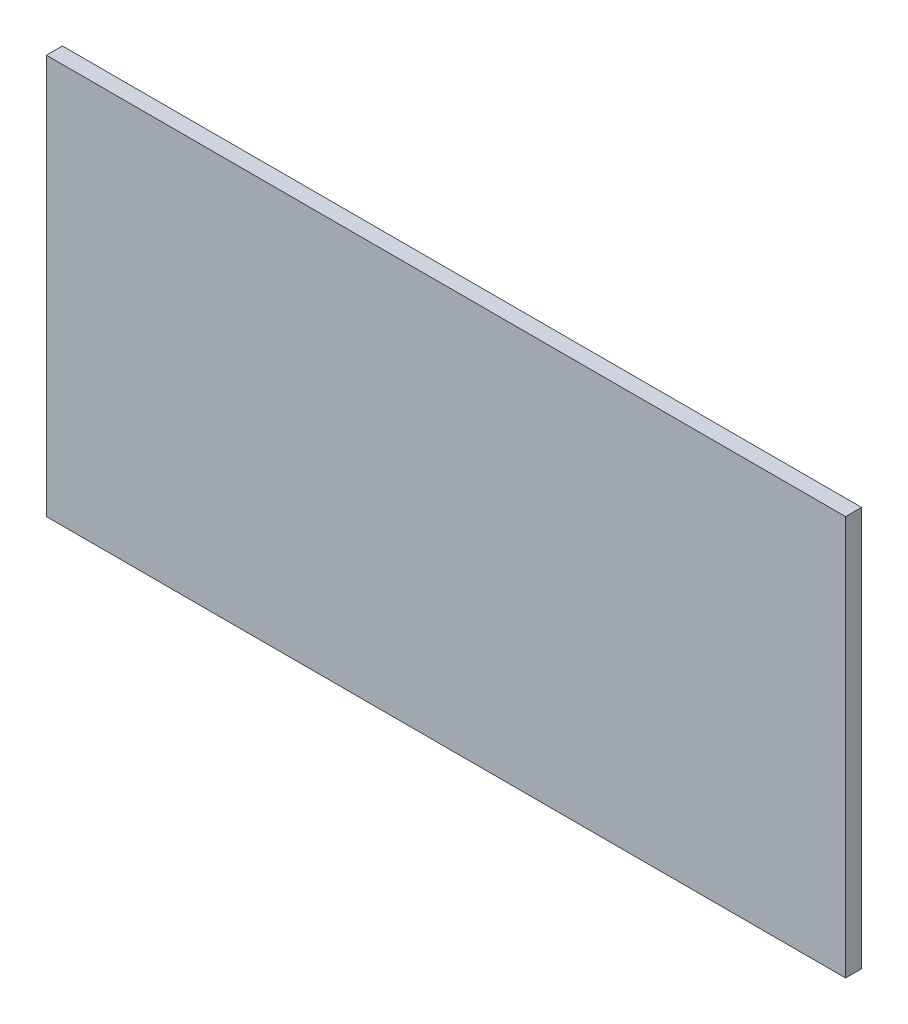
ISO-10303-21;
HEADER;
FILE_DESCRIPTION(('STEP AP214'),'2;1');
FILE_NAME('part.step','',(''),(''),'','','');
FILE_SCHEMA(('AUTOMOTIVE_DESIGN { 1 0 10303 214 1 1 1 1 }'));
ENDSEC;
DATA;
#1=APPLICATION_CONTEXT('core data for automotive mechanical design processes');
#2=APPLICATION_PROTOCOL_DEFINITION('international standard','automotive_design',2000,#1);
#3=PRODUCT_CONTEXT('',#1,'mechanical');
#4=PRODUCT('Part','Part','',(#3));
#5=PRODUCT_RELATED_PRODUCT_CATEGORY('part','',(#4));
#6=PRODUCT_DEFINITION_FORMATION('','',#4);
#7=PRODUCT_DEFINITION_CONTEXT('part definition',#1,'design');
#8=PRODUCT_DEFINITION('design','',#6,#7);
#9=PRODUCT_DEFINITION_SHAPE('','',#8);
#10=(LENGTH_UNIT() NAMED_UNIT(*) SI_UNIT(.MILLI.,.METRE.));
#11=(NAMED_UNIT(*) PLANE_ANGLE_UNIT() SI_UNIT($,.RADIAN.));
#12=(NAMED_UNIT(*) SI_UNIT($,.STERADIAN.) SOLID_ANGLE_UNIT());
#13=UNCERTAINTY_MEASURE_WITH_UNIT(LENGTH_MEASURE(1.E-05),#10,'distance_accuracy_value','');
#14=(GEOMETRIC_REPRESENTATION_CONTEXT(3) GLOBAL_UNCERTAINTY_ASSIGNED_CONTEXT((#13)) GLOBAL_UNIT_ASSIGNED_CONTEXT((#10,
#11,#12)) REPRESENTATION_CONTEXT('',''));
#15=CARTESIAN_POINT('',(0.,0.,0.));
#16=DIRECTION('',(0.,0.,1.));
#17=DIRECTION('',(1.,0.,0.));
#18=AXIS2_PLACEMENT_3D('',#15,#16,#17);
#19=CARTESIAN_POINT('',(400.,-200.,16.));
#20=DIRECTION('',(-1.,0.,0.));
#21=DIRECTION('',(0.,0.,1.));
#22=AXIS2_PLACEMENT_3D('',#19,#20,#21);
#23=PLANE('',#22);
#24=DIRECTION('',(0.,1.,0.));
#25=VECTOR('',#24,1.);
#26=CARTESIAN_POINT('',(400.,-200.,0.));
#27=LINE('',#26,#25);
#28=CARTESIAN_POINT('',(400.,-200.,0.));
#29=VERTEX_POINT('',#28);
#30=CARTESIAN_POINT('',(400.,200.,0.));
#31=VERTEX_POINT('',#30);
#32=EDGE_CURVE('E97',#29,#31,#27,.T.);
#33=ORIENTED_EDGE('',*,*,#32,.T.);
#34=DIRECTION('',(0.,0.,-1.));
#35=VECTOR('',#34,1.);
#36=CARTESIAN_POINT('',(400.,200.,16.));
#37=LINE('',#36,#35);
#38=CARTESIAN_POINT('',(400.,200.,16.));
#39=VERTEX_POINT('',#38);
#40=EDGE_CURVE('E11',#39,#31,#37,.T.);
#41=ORIENTED_EDGE('',*,*,#40,.F.);
#42=DIRECTION('',(0.,1.,0.));
#43=VECTOR('',#42,1.);
#44=CARTESIAN_POINT('',(400.,-200.,16.));
#45=LINE('',#44,#43);
#46=CARTESIAN_POINT('',(400.,-200.,16.));
#47=VERTEX_POINT('',#46);
#48=EDGE_CURVE('E85',#47,#39,#45,.T.);
#49=ORIENTED_EDGE('',*,*,#48,.F.);
#50=DIRECTION('',(0.,0.,-1.));
#51=VECTOR('',#50,1.);
#52=CARTESIAN_POINT('',(400.,-200.,16.));
#53=LINE('',#52,#51);
#54=EDGE_CURVE('E93',#47,#29,#53,.T.);
#55=ORIENTED_EDGE('',*,*,#54,.T.);
#56=EDGE_LOOP('',(#33,#41,#49,#55));
#57=FACE_BOUND('',#56,.T.);
#58=ADVANCED_FACE('F34',(#57),#23,.F.);
#59=CARTESIAN_POINT('',(-400.,200.,16.));
#60=DIRECTION('',(0.,-1.,0.));
#61=DIRECTION('',(0.,0.,-1.));
#62=AXIS2_PLACEMENT_3D('',#59,#60,#61);
#63=PLANE('',#62);
#64=DIRECTION('',(-1.,0.,0.));
#65=VECTOR('',#64,1.);
#66=CARTESIAN_POINT('',(-400.,200.,0.));
#67=LINE('',#66,#65);
#68=CARTESIAN_POINT('',(-400.,200.,0.));
#69=VERTEX_POINT('',#68);
#70=EDGE_CURVE('E89',#31,#69,#67,.T.);
#71=ORIENTED_EDGE('',*,*,#70,.T.);
#72=DIRECTION('',(0.,0.,-1.));
#73=VECTOR('',#72,1.);
#74=CARTESIAN_POINT('',(-400.,200.,16.));
#75=LINE('',#74,#73);
#76=CARTESIAN_POINT('',(-400.,200.,16.));
#77=VERTEX_POINT('',#76);
#78=EDGE_CURVE('E42',#77,#69,#75,.T.);
#79=ORIENTED_EDGE('',*,*,#78,.F.);
#80=DIRECTION('',(-1.,0.,0.));
#81=VECTOR('',#80,1.);
#82=CARTESIAN_POINT('',(-400.,200.,16.));
#83=LINE('',#82,#81);
#84=EDGE_CURVE('E80',#39,#77,#83,.T.);
#85=ORIENTED_EDGE('',*,*,#84,.F.);
#86=ORIENTED_EDGE('',*,*,#40,.T.);
#87=EDGE_LOOP('',(#71,#79,#85,#86));
#88=FACE_BOUND('',#87,.T.);
#89=ADVANCED_FACE('F88',(#88),#63,.F.);
#90=CARTESIAN_POINT('',(-400.,-200.,16.));
#91=DIRECTION('',(1.,0.,0.));
#92=DIRECTION('',(0.,0.,-1.));
#93=AXIS2_PLACEMENT_3D('',#90,#91,#92);
#94=PLANE('',#93);
#95=DIRECTION('',(0.,-1.,0.));
#96=VECTOR('',#95,1.);
#97=CARTESIAN_POINT('',(-400.,-200.,0.));
#98=LINE('',#97,#96);
#99=CARTESIAN_POINT('',(-400.,-200.,0.));
#100=VERTEX_POINT('',#99);
#101=EDGE_CURVE('E67',#69,#100,#98,.T.);
#102=ORIENTED_EDGE('',*,*,#101,.T.);
#103=DIRECTION('',(0.,0.,-1.));
#104=VECTOR('',#103,1.);
#105=CARTESIAN_POINT('',(-400.,-200.,16.));
#106=LINE('',#105,#104);
#107=CARTESIAN_POINT('',(-400.,-200.,16.));
#108=VERTEX_POINT('',#107);
#109=EDGE_CURVE('E90',#108,#100,#106,.T.);
#110=ORIENTED_EDGE('',*,*,#109,.F.);
#111=DIRECTION('',(0.,-1.,0.));
#112=VECTOR('',#111,1.);
#113=CARTESIAN_POINT('',(-400.,-200.,16.));
#114=LINE('',#113,#112);
#115=EDGE_CURVE('E83',#77,#108,#114,.T.);
#116=ORIENTED_EDGE('',*,*,#115,.F.);
#117=ORIENTED_EDGE('',*,*,#78,.T.);
#118=EDGE_LOOP('',(#102,#110,#116,#117));
#119=FACE_BOUND('',#118,.T.);
#120=ADVANCED_FACE('F91',(#119),#94,.F.);
#121=CARTESIAN_POINT('',(-400.,-200.,16.));
#122=DIRECTION('',(0.,1.,0.));
#123=DIRECTION('',(0.,0.,1.));
#124=AXIS2_PLACEMENT_3D('',#121,#122,#123);
#125=PLANE('',#124);
#126=DIRECTION('',(1.,0.,0.));
#127=VECTOR('',#126,1.);
#128=CARTESIAN_POINT('',(-400.,-200.,0.));
#129=LINE('',#128,#127);
#130=EDGE_CURVE('E73',#100,#29,#129,.T.);
#131=ORIENTED_EDGE('',*,*,#130,.T.);
#132=ORIENTED_EDGE('',*,*,#54,.F.);
#133=DIRECTION('',(1.,0.,0.));
#134=VECTOR('',#133,1.);
#135=CARTESIAN_POINT('',(-400.,-200.,16.));
#136=LINE('',#135,#134);
#137=EDGE_CURVE('E50',#108,#47,#136,.T.);
#138=ORIENTED_EDGE('',*,*,#137,.F.);
#139=ORIENTED_EDGE('',*,*,#109,.T.);
#140=EDGE_LOOP('',(#131,#132,#138,#139));
#141=FACE_BOUND('',#140,.T.);
#142=ADVANCED_FACE('F104',(#141),#125,.F.);
#143=CARTESIAN_POINT('',(0.,0.,16.));
#144=DIRECTION('',(0.,0.,-1.));
#145=DIRECTION('',(-1.,0.,0.));
#146=AXIS2_PLACEMENT_3D('',#143,#144,#145);
#147=PLANE('',#146);
#148=ORIENTED_EDGE('',*,*,#48,.T.);
#149=ORIENTED_EDGE('',*,*,#84,.T.);
#150=ORIENTED_EDGE('',*,*,#115,.T.);
#151=ORIENTED_EDGE('',*,*,#137,.T.);
#152=EDGE_LOOP('',(#148,#149,#150,#151));
#153=FACE_BOUND('',#152,.T.);
#154=ADVANCED_FACE('F81',(#153),#147,.F.);
#155=CARTESIAN_POINT('',(0.,0.,0.));
#156=DIRECTION('',(0.,0.,-1.));
#157=DIRECTION('',(-1.,0.,0.));
#158=AXIS2_PLACEMENT_3D('',#155,#156,#157);
#159=PLANE('',#158);
#160=ORIENTED_EDGE('',*,*,#32,.F.);
#161=ORIENTED_EDGE('',*,*,#130,.F.);
#162=ORIENTED_EDGE('',*,*,#101,.F.);
#163=ORIENTED_EDGE('',*,*,#70,.F.);
#164=EDGE_LOOP('',(#160,#161,#162,#163));
#165=FACE_BOUND('',#164,.T.);
#166=ADVANCED_FACE('F107',(#165),#159,.T.);
#167=CLOSED_SHELL('',(#58,#89,#120,#142,#154,#166));
#168=MANIFOLD_SOLID_BREP('B2',#167);
#169=ADVANCED_BREP_SHAPE_REPRESENTATION('',(#18,#168),#14);
#170=SHAPE_DEFINITION_REPRESENTATION(#9,#169);
ENDSEC;
END-ISO-10303-21;
